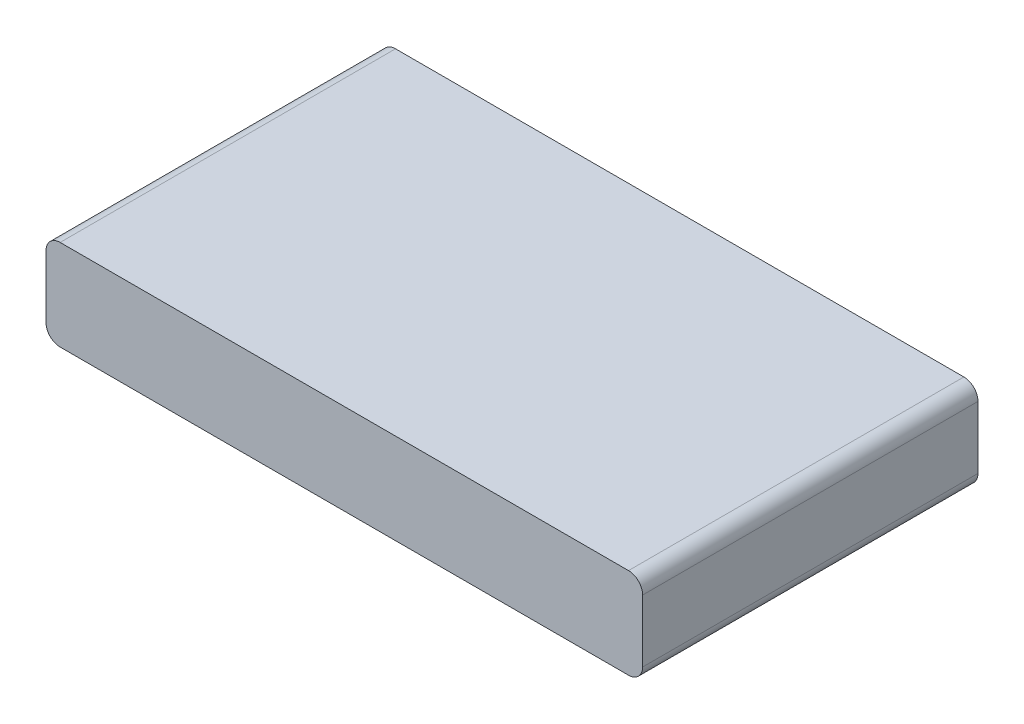
ISO-10303-21;
HEADER;
FILE_DESCRIPTION(('STEP AP214'),'2;1');
FILE_NAME('part.step','',(''),(''),'','','');
FILE_SCHEMA(('AUTOMOTIVE_DESIGN { 1 0 10303 214 1 1 1 1 }'));
ENDSEC;
DATA;
#1=APPLICATION_CONTEXT('core data for automotive mechanical design processes');
#2=APPLICATION_PROTOCOL_DEFINITION('international standard','automotive_design',2000,#1);
#3=PRODUCT_CONTEXT('',#1,'mechanical');
#4=PRODUCT('Part','Part','',(#3));
#5=PRODUCT_RELATED_PRODUCT_CATEGORY('part','',(#4));
#6=PRODUCT_DEFINITION_FORMATION('','',#4);
#7=PRODUCT_DEFINITION_CONTEXT('part definition',#1,'design');
#8=PRODUCT_DEFINITION('design','',#6,#7);
#9=PRODUCT_DEFINITION_SHAPE('','',#8);
#10=(LENGTH_UNIT() NAMED_UNIT(*) SI_UNIT(.MILLI.,.METRE.));
#11=(NAMED_UNIT(*) PLANE_ANGLE_UNIT() SI_UNIT($,.RADIAN.));
#12=(NAMED_UNIT(*) SI_UNIT($,.STERADIAN.) SOLID_ANGLE_UNIT());
#13=UNCERTAINTY_MEASURE_WITH_UNIT(LENGTH_MEASURE(1.E-05),#10,'distance_accuracy_value','');
#14=(GEOMETRIC_REPRESENTATION_CONTEXT(3) GLOBAL_UNCERTAINTY_ASSIGNED_CONTEXT((#13)) GLOBAL_UNIT_ASSIGNED_CONTEXT((#10,
#11,#12)) REPRESENTATION_CONTEXT('',''));
#15=CARTESIAN_POINT('',(0.,0.,0.));
#16=DIRECTION('',(0.,0.,1.));
#17=DIRECTION('',(1.,0.,0.));
#18=AXIS2_PLACEMENT_3D('',#15,#16,#17);
#19=CARTESIAN_POINT('',(0.,19.25,0.));
#20=DIRECTION('',(1.,0.,0.));
#21=DIRECTION('',(0.,0.,-1.));
#22=AXIS2_PLACEMENT_3D('',#19,#20,#21);
#23=PLANE('',#22);
#24=DIRECTION('',(0.,-1.,0.));
#25=VECTOR('',#24,1.);
#26=CARTESIAN_POINT('',(0.,19.25,-71.25));
#27=LINE('',#26,#25);
#28=CARTESIAN_POINT('',(0.,16.25,-71.25));
#29=VERTEX_POINT('',#28);
#30=CARTESIAN_POINT('',(0.,3.,-71.25));
#31=VERTEX_POINT('',#30);
#32=EDGE_CURVE('E128',#29,#31,#27,.T.);
#33=ORIENTED_EDGE('',*,*,#32,.T.);
#34=DIRECTION('',(0.,0.,1.));
#35=VECTOR('',#34,1.);
#36=CARTESIAN_POINT('',(0.,3.,0.));
#37=LINE('',#36,#35);
#38=CARTESIAN_POINT('',(0.,3.,0.));
#39=VERTEX_POINT('',#38);
#40=EDGE_CURVE('E11',#31,#39,#37,.T.);
#41=ORIENTED_EDGE('',*,*,#40,.T.);
#42=DIRECTION('',(0.,-1.,0.));
#43=VECTOR('',#42,1.);
#44=CARTESIAN_POINT('',(0.,19.25,0.));
#45=LINE('',#44,#43);
#46=CARTESIAN_POINT('',(0.,16.25,0.));
#47=VERTEX_POINT('',#46);
#48=EDGE_CURVE('E133',#47,#39,#45,.T.);
#49=ORIENTED_EDGE('',*,*,#48,.F.);
#50=DIRECTION('',(0.,0.,1.));
#51=VECTOR('',#50,1.);
#52=CARTESIAN_POINT('',(0.,16.25,0.));
#53=LINE('',#52,#51);
#54=EDGE_CURVE('E48',#47,#29,#53,.F.);
#55=ORIENTED_EDGE('',*,*,#54,.T.);
#56=EDGE_LOOP('',(#33,#41,#49,#55));
#57=FACE_BOUND('',#56,.T.);
#58=ADVANCED_FACE('F40',(#57),#23,.F.);
#59=CARTESIAN_POINT('',(0.,19.25,0.));
#60=DIRECTION('',(0.,0.,-1.));
#61=DIRECTION('',(-1.,0.,0.));
#62=AXIS2_PLACEMENT_3D('',#59,#60,#61);
#63=PLANE('',#62);
#64=DIRECTION('',(1.,0.,0.));
#65=VECTOR('',#64,1.);
#66=CARTESIAN_POINT('',(0.,0.,0.));
#67=LINE('',#66,#65);
#68=CARTESIAN_POINT('',(3.,0.,0.));
#69=VERTEX_POINT('',#68);
#70=CARTESIAN_POINT('',(123.75,0.,0.));
#71=VERTEX_POINT('',#70);
#72=EDGE_CURVE('E175',#69,#71,#67,.T.);
#73=ORIENTED_EDGE('',*,*,#72,.T.);
#74=CARTESIAN_POINT('',(123.75,3.,0.));
#75=DIRECTION('',(0.,0.,-1.));
#76=DIRECTION('',(-1.,0.,0.));
#77=AXIS2_PLACEMENT_3D('',#74,#75,#76);
#78=CIRCLE('',#77,3.);
#79=CARTESIAN_POINT('',(126.75,3.,0.));
#80=VERTEX_POINT('',#79);
#81=EDGE_CURVE('E150',#71,#80,#78,.F.);
#82=ORIENTED_EDGE('',*,*,#81,.T.);
#83=DIRECTION('',(0.,-1.,0.));
#84=VECTOR('',#83,1.);
#85=CARTESIAN_POINT('',(126.75,19.25,0.));
#86=LINE('',#85,#84);
#87=CARTESIAN_POINT('',(126.75,16.25,0.));
#88=VERTEX_POINT('',#87);
#89=EDGE_CURVE('E127',#88,#80,#86,.T.);
#90=ORIENTED_EDGE('',*,*,#89,.F.);
#91=CARTESIAN_POINT('',(123.75,16.25,0.));
#92=DIRECTION('',(0.,0.,-1.));
#93=DIRECTION('',(-1.,0.,0.));
#94=AXIS2_PLACEMENT_3D('',#91,#92,#93);
#95=CIRCLE('',#94,3.);
#96=CARTESIAN_POINT('',(123.75,19.25,0.));
#97=VERTEX_POINT('',#96);
#98=EDGE_CURVE('E132',#88,#97,#95,.F.);
#99=ORIENTED_EDGE('',*,*,#98,.T.);
#100=DIRECTION('',(1.,0.,0.));
#101=VECTOR('',#100,1.);
#102=CARTESIAN_POINT('',(0.,19.25,0.));
#103=LINE('',#102,#101);
#104=CARTESIAN_POINT('',(3.,19.25,0.));
#105=VERTEX_POINT('',#104);
#106=EDGE_CURVE('E169',#105,#97,#103,.T.);
#107=ORIENTED_EDGE('',*,*,#106,.F.);
#108=CARTESIAN_POINT('',(3.,16.25,0.));
#109=DIRECTION('',(0.,0.,-1.));
#110=DIRECTION('',(-1.,0.,0.));
#111=AXIS2_PLACEMENT_3D('',#108,#109,#110);
#112=CIRCLE('',#111,3.);
#113=EDGE_CURVE('E62',#105,#47,#112,.F.);
#114=ORIENTED_EDGE('',*,*,#113,.T.);
#115=ORIENTED_EDGE('',*,*,#48,.T.);
#116=CARTESIAN_POINT('',(3.,3.,0.));
#117=DIRECTION('',(0.,0.,-1.));
#118=DIRECTION('',(-1.,0.,0.));
#119=AXIS2_PLACEMENT_3D('',#116,#117,#118);
#120=CIRCLE('',#119,3.);
#121=EDGE_CURVE('E55',#39,#69,#120,.F.);
#122=ORIENTED_EDGE('',*,*,#121,.T.);
#123=EDGE_LOOP('',(#73,#82,#90,#99,#107,#114,#115,#122));
#124=FACE_BOUND('',#123,.T.);
#125=ADVANCED_FACE('F171',(#124),#63,.F.);
#126=CARTESIAN_POINT('',(126.75,19.25,0.));
#127=DIRECTION('',(-1.,0.,0.));
#128=DIRECTION('',(0.,0.,1.));
#129=AXIS2_PLACEMENT_3D('',#126,#127,#128);
#130=PLANE('',#129);
#131=ORIENTED_EDGE('',*,*,#89,.T.);
#132=DIRECTION('',(0.,0.,-1.));
#133=VECTOR('',#132,1.);
#134=CARTESIAN_POINT('',(126.75,3.,-71.25));
#135=LINE('',#134,#133);
#136=CARTESIAN_POINT('',(126.75,3.,-71.25));
#137=VERTEX_POINT('',#136);
#138=EDGE_CURVE('E126',#80,#137,#135,.T.);
#139=ORIENTED_EDGE('',*,*,#138,.T.);
#140=DIRECTION('',(0.,-1.,0.));
#141=VECTOR('',#140,1.);
#142=CARTESIAN_POINT('',(126.75,19.25,-71.25));
#143=LINE('',#142,#141);
#144=CARTESIAN_POINT('',(126.75,16.25,-71.25));
#145=VERTEX_POINT('',#144);
#146=EDGE_CURVE('E109',#145,#137,#143,.T.);
#147=ORIENTED_EDGE('',*,*,#146,.F.);
#148=DIRECTION('',(0.,0.,-1.));
#149=VECTOR('',#148,1.);
#150=CARTESIAN_POINT('',(126.75,16.25,0.));
#151=LINE('',#150,#149);
#152=EDGE_CURVE('E123',#145,#88,#151,.F.);
#153=ORIENTED_EDGE('',*,*,#152,.T.);
#154=EDGE_LOOP('',(#131,#139,#147,#153));
#155=FACE_BOUND('',#154,.T.);
#156=ADVANCED_FACE('F122',(#155),#130,.F.);
#157=CARTESIAN_POINT('',(0.,19.25,-71.25));
#158=DIRECTION('',(0.,0.,1.));
#159=DIRECTION('',(1.,0.,0.));
#160=AXIS2_PLACEMENT_3D('',#157,#158,#159);
#161=PLANE('',#160);
#162=ORIENTED_EDGE('',*,*,#146,.T.);
#163=CARTESIAN_POINT('',(123.75,3.,-71.25));
#164=DIRECTION('',(0.,0.,1.));
#165=DIRECTION('',(1.,0.,0.));
#166=AXIS2_PLACEMENT_3D('',#163,#164,#165);
#167=CIRCLE('',#166,3.);
#168=CARTESIAN_POINT('',(123.75,0.,-71.25));
#169=VERTEX_POINT('',#168);
#170=EDGE_CURVE('E116',#137,#169,#167,.F.);
#171=ORIENTED_EDGE('',*,*,#170,.T.);
#172=DIRECTION('',(-1.,0.,0.));
#173=VECTOR('',#172,1.);
#174=CARTESIAN_POINT('',(0.,0.,-71.25));
#175=LINE('',#174,#173);
#176=CARTESIAN_POINT('',(3.,0.,-71.25));
#177=VERTEX_POINT('',#176);
#178=EDGE_CURVE('E172',#169,#177,#175,.T.);
#179=ORIENTED_EDGE('',*,*,#178,.T.);
#180=CARTESIAN_POINT('',(3.,3.,-71.25));
#181=DIRECTION('',(0.,0.,1.));
#182=DIRECTION('',(1.,0.,0.));
#183=AXIS2_PLACEMENT_3D('',#180,#181,#182);
#184=CIRCLE('',#183,3.);
#185=EDGE_CURVE('E117',#177,#31,#184,.F.);
#186=ORIENTED_EDGE('',*,*,#185,.T.);
#187=ORIENTED_EDGE('',*,*,#32,.F.);
#188=CARTESIAN_POINT('',(3.,16.25,-71.25));
#189=DIRECTION('',(0.,0.,1.));
#190=DIRECTION('',(1.,0.,0.));
#191=AXIS2_PLACEMENT_3D('',#188,#189,#190);
#192=CIRCLE('',#191,3.);
#193=CARTESIAN_POINT('',(3.,19.25,-71.25));
#194=VERTEX_POINT('',#193);
#195=EDGE_CURVE('E135',#29,#194,#192,.F.);
#196=ORIENTED_EDGE('',*,*,#195,.T.);
#197=DIRECTION('',(-1.,0.,0.));
#198=VECTOR('',#197,1.);
#199=CARTESIAN_POINT('',(0.,19.25,-71.25));
#200=LINE('',#199,#198);
#201=CARTESIAN_POINT('',(123.75,19.25,-71.25));
#202=VERTEX_POINT('',#201);
#203=EDGE_CURVE('E111',#202,#194,#200,.T.);
#204=ORIENTED_EDGE('',*,*,#203,.F.);
#205=CARTESIAN_POINT('',(123.75,16.25,-71.25));
#206=DIRECTION('',(0.,0.,1.));
#207=DIRECTION('',(1.,0.,0.));
#208=AXIS2_PLACEMENT_3D('',#205,#206,#207);
#209=CIRCLE('',#208,3.);
#210=EDGE_CURVE('E106',#202,#145,#209,.F.);
#211=ORIENTED_EDGE('',*,*,#210,.T.);
#212=EDGE_LOOP('',(#162,#171,#179,#186,#187,#196,#204,#211));
#213=FACE_BOUND('',#212,.T.);
#214=ADVANCED_FACE('F108',(#213),#161,.F.);
#215=CARTESIAN_POINT('',(0.,19.25,0.));
#216=DIRECTION('',(0.,-1.,0.));
#217=DIRECTION('',(0.,0.,-1.));
#218=AXIS2_PLACEMENT_3D('',#215,#216,#217);
#219=PLANE('',#218);
#220=ORIENTED_EDGE('',*,*,#106,.T.);
#221=DIRECTION('',(0.,0.,-1.));
#222=VECTOR('',#221,1.);
#223=CARTESIAN_POINT('',(123.75,19.25,0.));
#224=LINE('',#223,#222);
#225=EDGE_CURVE('E155',#97,#202,#224,.T.);
#226=ORIENTED_EDGE('',*,*,#225,.T.);
#227=ORIENTED_EDGE('',*,*,#203,.T.);
#228=DIRECTION('',(0.,0.,1.));
#229=VECTOR('',#228,1.);
#230=CARTESIAN_POINT('',(3.,19.25,0.));
#231=LINE('',#230,#229);
#232=EDGE_CURVE('E152',#194,#105,#231,.T.);
#233=ORIENTED_EDGE('',*,*,#232,.T.);
#234=EDGE_LOOP('',(#220,#226,#227,#233));
#235=FACE_BOUND('',#234,.T.);
#236=ADVANCED_FACE('F168',(#235),#219,.F.);
#237=CARTESIAN_POINT('',(0.,0.,0.));
#238=DIRECTION('',(0.,-1.,0.));
#239=DIRECTION('',(0.,0.,-1.));
#240=AXIS2_PLACEMENT_3D('',#237,#238,#239);
#241=PLANE('',#240);
#242=ORIENTED_EDGE('',*,*,#178,.F.);
#243=DIRECTION('',(0.,0.,-1.));
#244=VECTOR('',#243,1.);
#245=CARTESIAN_POINT('',(123.75,0.,0.));
#246=LINE('',#245,#244);
#247=EDGE_CURVE('E145',#169,#71,#246,.F.);
#248=ORIENTED_EDGE('',*,*,#247,.T.);
#249=ORIENTED_EDGE('',*,*,#72,.F.);
#250=DIRECTION('',(0.,0.,1.));
#251=VECTOR('',#250,1.);
#252=CARTESIAN_POINT('',(3.,0.,-71.25));
#253=LINE('',#252,#251);
#254=EDGE_CURVE('E143',#69,#177,#253,.F.);
#255=ORIENTED_EDGE('',*,*,#254,.T.);
#256=EDGE_LOOP('',(#242,#248,#249,#255));
#257=FACE_BOUND('',#256,.T.);
#258=ADVANCED_FACE('F184',(#257),#241,.T.);
#259=CARTESIAN_POINT('',(123.75,3.,0.));
#260=DIRECTION('',(0.,0.,1.));
#261=DIRECTION('',(1.,0.,0.));
#262=AXIS2_PLACEMENT_3D('',#259,#260,#261);
#263=CYLINDRICAL_SURFACE('',#262,3.);
#264=ORIENTED_EDGE('',*,*,#81,.F.);
#265=ORIENTED_EDGE('',*,*,#247,.F.);
#266=ORIENTED_EDGE('',*,*,#170,.F.);
#267=ORIENTED_EDGE('',*,*,#138,.F.);
#268=EDGE_LOOP('',(#264,#265,#266,#267));
#269=FACE_BOUND('',#268,.T.);
#270=ADVANCED_FACE('F180',(#269),#263,.T.);
#271=CARTESIAN_POINT('',(123.75,16.25,0.));
#272=DIRECTION('',(0.,0.,-1.));
#273=DIRECTION('',(-1.,0.,0.));
#274=AXIS2_PLACEMENT_3D('',#271,#272,#273);
#275=CYLINDRICAL_SURFACE('',#274,3.);
#276=ORIENTED_EDGE('',*,*,#98,.F.);
#277=ORIENTED_EDGE('',*,*,#152,.F.);
#278=ORIENTED_EDGE('',*,*,#210,.F.);
#279=ORIENTED_EDGE('',*,*,#225,.F.);
#280=EDGE_LOOP('',(#276,#277,#278,#279));
#281=FACE_BOUND('',#280,.T.);
#282=ADVANCED_FACE('F131',(#281),#275,.T.);
#283=CARTESIAN_POINT('',(3.,3.,0.));
#284=DIRECTION('',(0.,0.,-1.));
#285=DIRECTION('',(-1.,0.,0.));
#286=AXIS2_PLACEMENT_3D('',#283,#284,#285);
#287=CYLINDRICAL_SURFACE('',#286,3.);
#288=ORIENTED_EDGE('',*,*,#185,.F.);
#289=ORIENTED_EDGE('',*,*,#254,.F.);
#290=ORIENTED_EDGE('',*,*,#121,.F.);
#291=ORIENTED_EDGE('',*,*,#40,.F.);
#292=EDGE_LOOP('',(#288,#289,#290,#291));
#293=FACE_BOUND('',#292,.T.);
#294=ADVANCED_FACE('F186',(#293),#287,.T.);
#295=CARTESIAN_POINT('',(3.,16.25,0.));
#296=DIRECTION('',(0.,0.,1.));
#297=DIRECTION('',(1.,0.,0.));
#298=AXIS2_PLACEMENT_3D('',#295,#296,#297);
#299=CYLINDRICAL_SURFACE('',#298,3.);
#300=ORIENTED_EDGE('',*,*,#195,.F.);
#301=ORIENTED_EDGE('',*,*,#54,.F.);
#302=ORIENTED_EDGE('',*,*,#113,.F.);
#303=ORIENTED_EDGE('',*,*,#232,.F.);
#304=EDGE_LOOP('',(#300,#301,#302,#303));
#305=FACE_BOUND('',#304,.T.);
#306=ADVANCED_FACE('F42',(#305),#299,.T.);
#307=CLOSED_SHELL('',(#58,#125,#156,#214,#236,#258,#270,#282,#294,#306));
#308=MANIFOLD_SOLID_BREP('B2',#307);
#309=ADVANCED_BREP_SHAPE_REPRESENTATION('',(#18,#308),#14);
#310=SHAPE_DEFINITION_REPRESENTATION(#9,#309);
ENDSEC;
END-ISO-10303-21;
